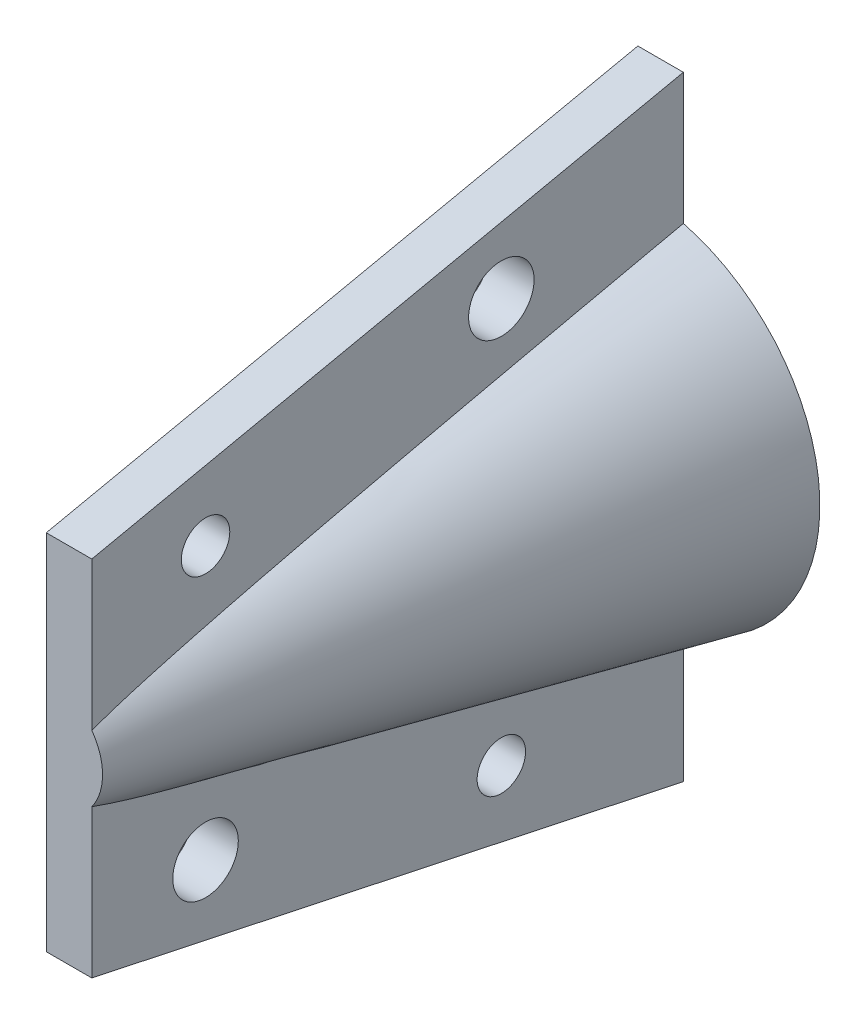
ISO-10303-21;
HEADER;
FILE_DESCRIPTION(('STEP AP214'),'2;1');
FILE_NAME('part.step','',(''),(''),'','','');
FILE_SCHEMA(('AUTOMOTIVE_DESIGN { 1 0 10303 214 1 1 1 1 }'));
ENDSEC;
DATA;
#1=APPLICATION_CONTEXT('core data for automotive mechanical design processes');
#2=APPLICATION_PROTOCOL_DEFINITION('international standard','automotive_design',2000,#1);
#3=PRODUCT_CONTEXT('',#1,'mechanical');
#4=PRODUCT('Part','Part','',(#3));
#5=PRODUCT_RELATED_PRODUCT_CATEGORY('part','',(#4));
#6=PRODUCT_DEFINITION_FORMATION('','',#4);
#7=PRODUCT_DEFINITION_CONTEXT('part definition',#1,'design');
#8=PRODUCT_DEFINITION('design','',#6,#7);
#9=PRODUCT_DEFINITION_SHAPE('','',#8);
#10=(LENGTH_UNIT() NAMED_UNIT(*) SI_UNIT(.MILLI.,.METRE.));
#11=(NAMED_UNIT(*) PLANE_ANGLE_UNIT() SI_UNIT($,.RADIAN.));
#12=(NAMED_UNIT(*) SI_UNIT($,.STERADIAN.) SOLID_ANGLE_UNIT());
#13=UNCERTAINTY_MEASURE_WITH_UNIT(LENGTH_MEASURE(1.E-05),#10,'distance_accuracy_value','');
#14=(GEOMETRIC_REPRESENTATION_CONTEXT(3) GLOBAL_UNCERTAINTY_ASSIGNED_CONTEXT((#13)) GLOBAL_UNIT_ASSIGNED_CONTEXT((#10,
#11,#12)) REPRESENTATION_CONTEXT('',''));
#15=CARTESIAN_POINT('',(0.,0.,0.));
#16=DIRECTION('',(0.,0.,1.));
#17=DIRECTION('',(1.,0.,0.));
#18=AXIS2_PLACEMENT_3D('',#15,#16,#17);
#19=CARTESIAN_POINT('',(0.,0.,0.));
#20=DIRECTION('',(0.,0.,1.));
#21=DIRECTION('',(1.,0.,0.));
#22=AXIS2_PLACEMENT_3D('',#19,#20,#21);
#23=PLANE('',#22);
#24=DIRECTION('',(1.,0.,0.));
#25=VECTOR('',#24,1.);
#26=CARTESIAN_POINT('',(-2.54000000000001,-17.145,0.));
#27=LINE('',#26,#25);
#28=CARTESIAN_POINT('',(0.,-17.145,0.));
#29=VERTEX_POINT('',#28);
#30=CARTESIAN_POINT('',(2.54000000000002,-17.145,0.));
#31=VERTEX_POINT('',#30);
#32=EDGE_CURVE('E188',#29,#31,#27,.T.);
#33=ORIENTED_EDGE('',*,*,#32,.F.);
#34=DIRECTION('',(0.,-1.,0.));
#35=VECTOR('',#34,1.);
#36=CARTESIAN_POINT('',(0.,-17.145,0.));
#37=LINE('',#36,#35);
#38=CARTESIAN_POINT('',(0.,-8.89,0.));
#39=VERTEX_POINT('',#38);
#40=EDGE_CURVE('E122',#39,#29,#37,.T.);
#41=ORIENTED_EDGE('',*,*,#40,.F.);
#42=CARTESIAN_POINT('',(0.,0.,0.));
#43=DIRECTION('',(0.,0.,1.));
#44=DIRECTION('',(1.,0.,0.));
#45=AXIS2_PLACEMENT_3D('',#42,#43,#44);
#46=CIRCLE('',#45,8.89);
#47=CARTESIAN_POINT('',(0.,8.89,0.));
#48=VERTEX_POINT('',#47);
#49=EDGE_CURVE('E121',#39,#48,#46,.T.);
#50=ORIENTED_EDGE('',*,*,#49,.T.);
#51=CARTESIAN_POINT('',(0.,17.145,0.));
#52=VERTEX_POINT('',#51);
#53=EDGE_CURVE('E104',#52,#48,#37,.T.);
#54=ORIENTED_EDGE('',*,*,#53,.F.);
#55=DIRECTION('',(-1.,0.,0.));
#56=VECTOR('',#55,1.);
#57=CARTESIAN_POINT('',(-2.53999999999999,17.145,0.));
#58=LINE('',#57,#56);
#59=CARTESIAN_POINT('',(2.54,17.145,0.));
#60=VERTEX_POINT('',#59);
#61=EDGE_CURVE('E118',#60,#52,#58,.T.);
#62=ORIENTED_EDGE('',*,*,#61,.F.);
#63=DIRECTION('',(0.,1.,0.));
#64=VECTOR('',#63,1.);
#65=CARTESIAN_POINT('',(2.54,17.145,0.));
#66=LINE('',#65,#64);
#67=CARTESIAN_POINT('',(2.54000000000001,9.83737769936683,0.));
#68=VERTEX_POINT('',#67);
#69=EDGE_CURVE('E127',#68,#60,#66,.T.);
#70=ORIENTED_EDGE('',*,*,#69,.F.);
#71=CARTESIAN_POINT('',(0.,0.,0.));
#72=DIRECTION('',(0.,0.,1.));
#73=DIRECTION('',(1.,0.,0.));
#74=AXIS2_PLACEMENT_3D('',#71,#72,#73);
#75=CIRCLE('',#74,10.16);
#76=CARTESIAN_POINT('',(2.54000000000002,-9.83737769936683,0.));
#77=VERTEX_POINT('',#76);
#78=EDGE_CURVE('E131',#77,#68,#75,.T.);
#79=ORIENTED_EDGE('',*,*,#78,.F.);
#80=DIRECTION('',(0.,1.,0.));
#81=VECTOR('',#80,1.);
#82=CARTESIAN_POINT('',(2.54000000000002,-9.83737769936683,0.));
#83=LINE('',#82,#81);
#84=EDGE_CURVE('E190',#31,#77,#83,.T.);
#85=ORIENTED_EDGE('',*,*,#84,.F.);
#86=EDGE_LOOP('',(#33,#41,#50,#54,#62,#70,#79,#85));
#87=FACE_BOUND('',#86,.T.);
#88=ADVANCED_FACE('F35',(#87),#23,.F.);
#89=CARTESIAN_POINT('',(-2.54000000000001,-17.145,0.));
#90=DIRECTION('',(0.,-0.978147600733806,0.207911690817759));
#91=DIRECTION('',(0.,-0.207911690817759,-0.978147600733806));
#92=AXIS2_PLACEMENT_3D('',#89,#90,#91);
#93=PLANE('',#92);
#94=DIRECTION('',(-1.,0.,0.));
#95=VECTOR('',#94,1.);
#96=CARTESIAN_POINT('',(-2.54000000000001,-10.1263823336559,33.02));
#97=LINE('',#96,#95);
#98=CARTESIAN_POINT('',(0.,-10.1263823336559,33.02));
#99=VERTEX_POINT('',#98);
#100=CARTESIAN_POINT('',(2.54000000000002,-10.1263823336559,33.02));
#101=VERTEX_POINT('',#100);
#102=EDGE_CURVE('E126',#99,#101,#97,.F.);
#103=ORIENTED_EDGE('',*,*,#102,.F.);
#104=DIRECTION('',(0.,0.207911690817759,0.978147600733806));
#105=VECTOR('',#104,1.);
#106=CARTESIAN_POINT('',(0.,-17.145,0.));
#107=LINE('',#106,#105);
#108=EDGE_CURVE('E110',#99,#29,#107,.F.);
#109=ORIENTED_EDGE('',*,*,#108,.T.);
#110=ORIENTED_EDGE('',*,*,#32,.T.);
#111=DIRECTION('',(0.,0.207911690817759,0.978147600733806));
#112=VECTOR('',#111,1.);
#113=CARTESIAN_POINT('',(2.54000000000002,-10.1138894519576,33.078774387392));
#114=LINE('',#113,#112);
#115=EDGE_CURVE('E11',#101,#31,#114,.F.);
#116=ORIENTED_EDGE('',*,*,#115,.F.);
#117=EDGE_LOOP('',(#103,#109,#110,#116));
#118=FACE_BOUND('',#117,.T.);
#119=ADVANCED_FACE('F154',(#118),#93,.T.);
#120=CARTESIAN_POINT('',(2.54000000000002,-9.83737769936683,33.02));
#121=DIRECTION('',(-1.,0.,0.));
#122=DIRECTION('',(0.,-1.,0.));
#123=AXIS2_PLACEMENT_3D('',#120,#121,#122);
#124=PLANE('',#123);
#125=CARTESIAN_POINT('',(2.54000000000002,-11.2859994979387,10.16));
#126=DIRECTION('',(-1.,0.,0.));
#127=DIRECTION('',(0.,-1.,0.));
#128=AXIS2_PLACEMENT_3D('',#125,#126,#127);
#129=CIRCLE('',#128,1.35254999999999);
#130=CARTESIAN_POINT('',(2.54000000000002,-12.6385494979387,10.16));
#131=VERTEX_POINT('',#130);
#132=EDGE_CURVE('E172',#131,#131,#129,.T.);
#133=ORIENTED_EDGE('',*,*,#132,.T.);
#134=EDGE_LOOP('',(#133));
#135=FACE_BOUND('',#134,.T.);
#136=CARTESIAN_POINT('',(2.54000000000002,-7.59012617854878,26.67));
#137=DIRECTION('',(-1.,0.,0.));
#138=DIRECTION('',(0.,-1.,0.));
#139=AXIS2_PLACEMENT_3D('',#136,#137,#138);
#140=CIRCLE('',#139,1.8288);
#141=CARTESIAN_POINT('',(2.54000000000002,-9.41892617854878,26.67));
#142=VERTEX_POINT('',#141);
#143=EDGE_CURVE('E169',#142,#142,#140,.T.);
#144=ORIENTED_EDGE('',*,*,#143,.T.);
#145=EDGE_LOOP('',(#144));
#146=FACE_BOUND('',#145,.T.);
#147=ORIENTED_EDGE('',*,*,#84,.T.);
#148=CARTESIAN_POINT('',(2.54000000000002,-9.83737769936683,0.));
#149=CARTESIAN_POINT('',(2.54000000000002,-9.68756772433314,0.682413990701998));
#150=CARTESIAN_POINT('',(2.54000000000002,-9.53755664341647,1.36478381665482));
#151=CARTESIAN_POINT('',(2.54000000000002,-9.23706393861361,2.72942018096307));
#152=CARTESIAN_POINT('',(2.54000000000002,-9.0865823145077,3.4116867192701));
#153=CARTESIAN_POINT('',(2.54000000000002,-8.63430453119013,5.45842028191158));
#154=CARTESIAN_POINT('',(2.54000000000002,-8.3317000930989,6.8227089423906));
#155=CARTESIAN_POINT('',(2.54000000000002,-7.72157487250142,9.55940087159057));
#156=CARTESIAN_POINT('',(2.54000000000002,-7.41403498609427,10.931799883625));
#157=CARTESIAN_POINT('',(2.54000000000002,-6.79469933495965,13.6755308297857));
#158=CARTESIAN_POINT('',(2.54000000000002,-6.48290389487147,15.0468628369664));
#159=CARTESIAN_POINT('',(2.54000000000002,-6.01823001727029,17.0682274434439));
#160=CARTESIAN_POINT('',(2.54000000000002,-5.8678882802859,17.7188429770867));
#161=CARTESIAN_POINT('',(2.54000000000002,-5.56533466250592,19.0196387689779));
#162=CARTESIAN_POINT('',(2.54000000000002,-5.41312278391347,19.6698190277382));
#163=CARTESIAN_POINT('',(2.54000000000002,-5.10627850511482,20.9697666746442));
#164=CARTESIAN_POINT('',(2.54000000000002,-4.9516455562409,21.6195339334352));
#165=CARTESIAN_POINT('',(2.54000000000002,-4.63925383578056,22.9183015412719));
#166=CARTESIAN_POINT('',(2.54000000000002,-4.4814951413943,23.56730190884));
#167=CARTESIAN_POINT('',(2.54000000000002,-4.1624688302227,24.8612601975363));
#168=CARTESIAN_POINT('',(2.54000000000002,-4.00122079931752,25.5062229393327));
#169=CARTESIAN_POINT('',(2.54000000000002,-3.67279458191474,26.7947146838397));
#170=CARTESIAN_POINT('',(2.54000000000002,-3.50561582594852,27.4382435425289));
#171=CARTESIAN_POINT('',(2.54000000000002,-3.24815581539548,28.4016676179463));
#172=CARTESIAN_POINT('',(2.54000000000002,-3.16123134505902,28.7224590095973));
#173=CARTESIAN_POINT('',(2.54000000000002,-2.98452465863213,29.363252329111));
#174=CARTESIAN_POINT('',(2.54000000000002,-2.89474247810544,29.6832542667451));
#175=CARTESIAN_POINT('',(2.54000000000002,-2.71148241730856,30.3221471797272));
#176=CARTESIAN_POINT('',(2.54000000000002,-2.61800511162621,30.6410383194771));
#177=CARTESIAN_POINT('',(2.54000000000002,-2.42607102736818,31.2773138481783));
#178=CARTESIAN_POINT('',(2.54000000000002,-2.3276145293265,31.5946983209176));
#179=CARTESIAN_POINT('',(2.54000000000002,-2.18662033533218,32.0318202024427));
#180=CARTESIAN_POINT('',(2.54000000000002,-2.14711168360863,32.1525342013287));
#181=CARTESIAN_POINT('',(2.54000000000002,-2.06686963714619,32.3935515426582));
#182=CARTESIAN_POINT('',(2.54000000000002,-2.02613625603091,32.5138548896531));
#183=CARTESIAN_POINT('',(2.54000000000002,-1.90184786529841,32.8739279679377));
#184=CARTESIAN_POINT('',(2.54000000000002,-1.81616695709921,33.1129787681758));
#185=CARTESIAN_POINT('',(2.54000000000002,-1.68135865303506,33.4694450811361));
#186=CARTESIAN_POINT('',(2.54000000000002,-1.6353266004435,33.5880305305546));
#187=CARTESIAN_POINT('',(2.54000000000002,-1.54065974872791,33.8241398865244));
#188=CARTESIAN_POINT('',(2.54000000000002,-1.4920253822858,33.9416639657732));
#189=CARTESIAN_POINT('',(2.54000000000002,-1.39135416542274,34.1754686135184));
#190=CARTESIAN_POINT('',(2.54000000000002,-1.33931235263483,34.2917470679559));
#191=CARTESIAN_POINT('',(2.54000000000002,-1.25790811791961,34.4646326770273));
#192=CARTESIAN_POINT('',(2.54000000000002,-1.23020822705165,34.522021726785));
#193=CARTESIAN_POINT('',(2.54000000000002,-1.17348385569872,34.6361515415849));
#194=CARTESIAN_POINT('',(2.54000000000002,-1.14445916874566,34.6928922038419));
#195=CARTESIAN_POINT('',(2.54000000000002,-1.11466907754045,34.7492365451219));
#196=B_SPLINE_CURVE_WITH_KNOTS('',3,(#148,#149,#150,#151,#152,#153,#154,#155,#156,#157,#158,
#159,#160,#161,#162,#163,#164,#165,#166,#167,#168,#169,#170,#171,#172,#173,#174,#175,#176,#177,
#178,#179,#180,#181,#182,#183,#184,#185,#186,#187,#188,#189,#190,#191,#192,#193,#194,#195),
.UNSPECIFIED.,.F.,.F.,(4,2,2,2,2,2,2,2,2,2,2,2,2,2,2,2,2,2,2,2,2,2,2,4),(0.,2.09599298225496,
4.19198694341505,8.3843198084463,12.6036214784442,16.8226030540303,18.8258805496714,
20.8291556855578,22.8328915745232,24.8365780364376,26.8310044840718,28.8256229577834,
29.8226926242112,30.8197498871136,31.8166527139548,32.8134994364646,33.1945380056024,
33.5755723377205,34.3372693856696,34.7188653847714,35.100398132582,35.4824994390271,
35.6736572018797,35.8648448588759),.UNSPECIFIED.);
#197=CARTESIAN_POINT('',(2.54000000000002,-1.84842716010257,33.02));
#198=VERTEX_POINT('',#197);
#199=EDGE_CURVE('E44',#198,#77,#196,.F.);
#200=ORIENTED_EDGE('',*,*,#199,.F.);
#201=DIRECTION('',(0.,1.,0.));
#202=VECTOR('',#201,1.);
#203=CARTESIAN_POINT('',(2.54000000000002,-9.83737769936683,33.02));
#204=LINE('',#203,#202);
#205=EDGE_CURVE('E129',#101,#198,#204,.T.);
#206=ORIENTED_EDGE('',*,*,#205,.F.);
#207=ORIENTED_EDGE('',*,*,#115,.T.);
#208=EDGE_LOOP('',(#147,#200,#206,#207));
#209=FACE_BOUND('',#208,.T.);
#210=ADVANCED_FACE('F150',(#135,#146,#209),#124,.F.);
#211=CARTESIAN_POINT('',(0.,0.,0.));
#212=DIRECTION('',(0.,0.,-1.));
#213=DIRECTION('',(1.,0.,0.));
#214=AXIS2_PLACEMENT_3D('',#211,#212,#213);
#215=CONICAL_SURFACE('',#214,10.16,0.20943951023932);
#216=ORIENTED_EDGE('',*,*,#78,.T.);
#217=CARTESIAN_POINT('',(2.54000000000002,1.84842716010258,33.02));
#218=CARTESIAN_POINT('',(2.54000000000002,1.88532649026919,32.9178343025848));
#219=CARTESIAN_POINT('',(2.54000000000002,1.92159846079302,32.8154445786237));
#220=CARTESIAN_POINT('',(2.54000000000002,1.9930437538059,32.6102857652073));
#221=CARTESIAN_POINT('',(2.54000000000002,2.02821711019649,32.507516687568));
#222=CARTESIAN_POINT('',(2.54000000000002,2.13231820827504,32.1987591572988));
#223=CARTESIAN_POINT('',(2.54000000000002,2.19983593540039,31.9922953634997));
#224=CARTESIAN_POINT('',(2.54000000000002,2.33195163464846,31.5785206024548));
#225=CARTESIAN_POINT('',(2.54000000000002,2.39655061821071,31.371209956251));
#226=CARTESIAN_POINT('',(2.54000000000002,2.52344313226656,30.9558779252721));
#227=CARTESIAN_POINT('',(2.54000000000002,2.58573657972657,30.747856515193));
#228=CARTESIAN_POINT('',(2.54000000000002,2.76975780744669,30.1232126676885));
#229=CARTESIAN_POINT('',(2.54000000000002,2.88870177856666,29.7057708577681));
#230=CARTESIAN_POINT('',(2.54000000000002,3.121455027043,28.8694192444513));
#231=CARTESIAN_POINT('',(2.54000000000002,3.23526372060184,28.4505092799543));
#232=CARTESIAN_POINT('',(2.54000000000002,3.45892821428563,27.612273252775));
#233=CARTESIAN_POINT('',(2.54000000000002,3.56878938525734,27.1929486199949));
#234=CARTESIAN_POINT('',(2.54000000000002,3.78563191227972,26.353554169401));
#235=CARTESIAN_POINT('',(2.54000000000001,3.89261324655157,25.9334843459774));
#236=CARTESIAN_POINT('',(2.54000000000001,4.10432066604424,25.0927659759743));
#237=CARTESIAN_POINT('',(2.54000000000001,4.20904669221686,24.6721174145485));
#238=CARTESIAN_POINT('',(2.54000000000001,4.41668569774778,23.8303726743704));
#239=CARTESIAN_POINT('',(2.54000000000001,4.51959867278519,23.4092764945537));
#240=CARTESIAN_POINT('',(2.54000000000001,4.82614308903227,22.1454267084387));
#241=CARTESIAN_POINT('',(2.54000000000001,5.02757315653803,21.3021393217278));
#242=CARTESIAN_POINT('',(2.54000000000001,5.42636416038714,19.6146204307214));
#243=CARTESIAN_POINT('',(2.54000000000001,5.62372515969055,18.7703889412473));
#244=CARTESIAN_POINT('',(2.54000000000001,6.01562534340995,17.0805817149503));
#245=CARTESIAN_POINT('',(2.54000000000001,6.21016221980736,16.2350054433735));
#246=CARTESIAN_POINT('',(2.54000000000001,6.59698692638984,14.5433360273084));
#247=CARTESIAN_POINT('',(2.54000000000001,6.78927474815966,13.6972428808985));
#248=CARTESIAN_POINT('',(2.54000000000001,7.36354195087345,11.158441241484));
#249=CARTESIAN_POINT('',(2.54000000000001,7.74293930519382,9.46514878074614));
#250=CARTESIAN_POINT('',(2.54000000000001,8.26436886126616,7.12381998866297));
#251=CARTESIAN_POINT('',(2.54000000000001,8.40826417541228,6.47619683489967));
#252=CARTESIAN_POINT('',(2.54000000000001,8.69549462246491,5.1808217177119));
#253=CARTESIAN_POINT('',(2.54000000000001,8.83882975168182,4.53306975346845));
#254=CARTESIAN_POINT('',(2.54000000000001,9.12494099369508,3.23781546339532));
#255=CARTESIAN_POINT('',(2.54000000000001,9.267717370226,2.5903131957885));
#256=CARTESIAN_POINT('',(2.54000000000001,9.55284859361736,1.29522049260085));
#257=CARTESIAN_POINT('',(2.54000000000001,9.69520344335438,0.647630057653384));
#258=CARTESIAN_POINT('',(2.54000000000001,9.83737769936684,0.));
#259=B_SPLINE_CURVE_WITH_KNOTS('',3,(#217,#218,#219,#220,#221,#222,#223,#224,#225,#226,#227,
#228,#229,#230,#231,#232,#233,#234,#235,#236,#237,#238,#239,#240,#241,#242,#243,#244,#245,#246,
#247,#248,#249,#250,#251,#252,#253,#254,#255,#256,#257,#258),.UNSPECIFIED.,.F.,.F.,(4,2,2,2,2,2,
2,2,2,2,2,2,2,2,2,2,2,2,2,2,4),(0.,0.325869280104377,0.651728494432599,1.30336714529924,
1.95477822257267,2.60621273755009,3.90832798367286,5.21059088807494,6.51100916318767,
7.811437269972,9.11189938310872,10.4123645950969,13.0133799503532,15.6143550302497,
18.2173480046348,20.8203507154894,26.026165978288,28.0164159067599,30.0066789218138,
31.995849104548,33.9850056813769),.UNSPECIFIED.);
#260=CARTESIAN_POINT('',(2.54000000000002,1.84842716010258,33.02));
#261=VERTEX_POINT('',#260);
#262=EDGE_CURVE('E146',#261,#68,#259,.T.);
#263=ORIENTED_EDGE('',*,*,#262,.F.);
#264=CARTESIAN_POINT('',(0.,0.,33.02));
#265=DIRECTION('',(0.,0.,1.));
#266=DIRECTION('',(1.,0.,0.));
#267=AXIS2_PLACEMENT_3D('',#264,#265,#266);
#268=CIRCLE('',#267,3.14138233365587);
#269=EDGE_CURVE('E136',#198,#261,#268,.T.);
#270=ORIENTED_EDGE('',*,*,#269,.F.);
#271=ORIENTED_EDGE('',*,*,#199,.T.);
#272=EDGE_LOOP('',(#216,#263,#270,#271));
#273=FACE_BOUND('',#272,.T.);
#274=ADVANCED_FACE('F148',(#273),#215,.T.);
#275=CARTESIAN_POINT('',(2.54,17.145,33.02));
#276=DIRECTION('',(-1.,0.,0.));
#277=DIRECTION('',(0.,-1.,0.));
#278=AXIS2_PLACEMENT_3D('',#275,#276,#277);
#279=PLANE('',#278);
#280=CARTESIAN_POINT('',(2.54000000000001,7.59012617854878,26.67));
#281=DIRECTION('',(-1.,0.,0.));
#282=DIRECTION('',(0.,-1.,0.));
#283=AXIS2_PLACEMENT_3D('',#280,#281,#282);
#284=CIRCLE('',#283,1.35254999999999);
#285=CARTESIAN_POINT('',(2.54000000000001,6.23757617854879,26.67));
#286=VERTEX_POINT('',#285);
#287=EDGE_CURVE('E174',#286,#286,#284,.T.);
#288=ORIENTED_EDGE('',*,*,#287,.T.);
#289=EDGE_LOOP('',(#288));
#290=FACE_BOUND('',#289,.T.);
#291=CARTESIAN_POINT('',(2.54000000000001,11.2859994979387,10.16));
#292=DIRECTION('',(-1.,0.,0.));
#293=DIRECTION('',(0.,-1.,0.));
#294=AXIS2_PLACEMENT_3D('',#291,#292,#293);
#295=CIRCLE('',#294,1.8288);
#296=CARTESIAN_POINT('',(2.54000000000001,9.45719949793872,10.16));
#297=VERTEX_POINT('',#296);
#298=EDGE_CURVE('E171',#297,#297,#295,.T.);
#299=ORIENTED_EDGE('',*,*,#298,.T.);
#300=EDGE_LOOP('',(#299));
#301=FACE_BOUND('',#300,.T.);
#302=ORIENTED_EDGE('',*,*,#69,.T.);
#303=DIRECTION('',(0.,-0.207911690817759,0.978147600733806));
#304=VECTOR('',#303,1.);
#305=CARTESIAN_POINT('',(2.54,17.145,0.));
#306=LINE('',#305,#304);
#307=CARTESIAN_POINT('',(2.54000000000001,10.1263823336558,33.02));
#308=VERTEX_POINT('',#307);
#309=EDGE_CURVE('E125',#308,#60,#306,.F.);
#310=ORIENTED_EDGE('',*,*,#309,.F.);
#311=DIRECTION('',(0.,1.,0.));
#312=VECTOR('',#311,1.);
#313=CARTESIAN_POINT('',(2.54,17.145,33.02));
#314=LINE('',#313,#312);
#315=EDGE_CURVE('E60',#261,#308,#314,.T.);
#316=ORIENTED_EDGE('',*,*,#315,.F.);
#317=ORIENTED_EDGE('',*,*,#262,.T.);
#318=EDGE_LOOP('',(#302,#310,#316,#317));
#319=FACE_BOUND('',#318,.T.);
#320=ADVANCED_FACE('F156',(#290,#301,#319),#279,.F.);
#321=CARTESIAN_POINT('',(-2.53999999999999,17.145,0.));
#322=DIRECTION('',(0.,0.978147600733806,0.207911690817759));
#323=DIRECTION('',(0.,-0.207911690817759,0.978147600733806));
#324=AXIS2_PLACEMENT_3D('',#321,#322,#323);
#325=PLANE('',#324);
#326=ORIENTED_EDGE('',*,*,#61,.T.);
#327=DIRECTION('',(0.,0.207911690817759,-0.978147600733806));
#328=VECTOR('',#327,1.);
#329=CARTESIAN_POINT('',(0.,17.145,0.));
#330=LINE('',#329,#328);
#331=CARTESIAN_POINT('',(0.,10.1263823336558,33.02));
#332=VERTEX_POINT('',#331);
#333=EDGE_CURVE('E101',#52,#332,#330,.F.);
#334=ORIENTED_EDGE('',*,*,#333,.T.);
#335=DIRECTION('',(1.,0.,0.));
#336=VECTOR('',#335,1.);
#337=CARTESIAN_POINT('',(-2.53999999999999,10.1263823336558,33.02));
#338=LINE('',#337,#336);
#339=EDGE_CURVE('E137',#308,#332,#338,.F.);
#340=ORIENTED_EDGE('',*,*,#339,.F.);
#341=ORIENTED_EDGE('',*,*,#309,.T.);
#342=EDGE_LOOP('',(#326,#334,#340,#341));
#343=FACE_BOUND('',#342,.T.);
#344=ADVANCED_FACE('F37',(#343),#325,.T.);
#345=CARTESIAN_POINT('',(0.,0.,33.02));
#346=DIRECTION('',(0.,0.,1.));
#347=DIRECTION('',(1.,0.,0.));
#348=AXIS2_PLACEMENT_3D('',#345,#346,#347);
#349=PLANE('',#348);
#350=DIRECTION('',(0.,-1.,0.));
#351=VECTOR('',#350,1.);
#352=CARTESIAN_POINT('',(0.,-17.145,33.02));
#353=LINE('',#352,#351);
#354=EDGE_CURVE('E106',#332,#99,#353,.T.);
#355=ORIENTED_EDGE('',*,*,#354,.T.);
#356=ORIENTED_EDGE('',*,*,#102,.T.);
#357=ORIENTED_EDGE('',*,*,#205,.T.);
#358=ORIENTED_EDGE('',*,*,#269,.T.);
#359=ORIENTED_EDGE('',*,*,#315,.T.);
#360=ORIENTED_EDGE('',*,*,#339,.T.);
#361=EDGE_LOOP('',(#355,#356,#357,#358,#359,#360));
#362=FACE_BOUND('',#361,.T.);
#363=ADVANCED_FACE('F198',(#362),#349,.T.);
#364=CARTESIAN_POINT('',(0.,0.,0.));
#365=DIRECTION('',(0.,0.,-1.));
#366=DIRECTION('',(1.,0.,0.));
#367=AXIS2_PLACEMENT_3D('',#364,#365,#366);
#368=CONICAL_SURFACE('',#367,8.89,0.244346095279206);
#369=DIRECTION('',(0.,-0.241921895599668,-0.970295726275996));
#370=VECTOR('',#369,1.);
#371=CARTESIAN_POINT('',(0.,0.,35.6558424991336));
#372=LINE('',#371,#370);
#373=CARTESIAN_POINT('',(0.,-1.29048247333985,30.48));
#374=VERTEX_POINT('',#373);
#375=EDGE_CURVE('E111',#374,#39,#372,.T.);
#376=ORIENTED_EDGE('',*,*,#375,.F.);
#377=CARTESIAN_POINT('',(0.,0.,30.48));
#378=DIRECTION('',(0.,0.,1.));
#379=DIRECTION('',(1.,0.,0.));
#380=AXIS2_PLACEMENT_3D('',#377,#378,#379);
#381=CIRCLE('',#380,1.29048247333985);
#382=CARTESIAN_POINT('',(0.,1.29048247333985,30.48));
#383=VERTEX_POINT('',#382);
#384=EDGE_CURVE('E185',#374,#383,#381,.T.);
#385=ORIENTED_EDGE('',*,*,#384,.T.);
#386=DIRECTION('',(0.,-0.241921895599668,0.970295726275996));
#387=VECTOR('',#386,1.);
#388=CARTESIAN_POINT('',(0.,0.,35.6558424991336));
#389=LINE('',#388,#387);
#390=EDGE_CURVE('E52',#48,#383,#389,.T.);
#391=ORIENTED_EDGE('',*,*,#390,.F.);
#392=ORIENTED_EDGE('',*,*,#49,.F.);
#393=EDGE_LOOP('',(#376,#385,#391,#392));
#394=FACE_BOUND('',#393,.T.);
#395=ADVANCED_FACE('F207',(#394),#368,.F.);
#396=CARTESIAN_POINT('',(0.,0.,29.4862047133879));
#397=DIRECTION('',(0.,0.,1.));
#398=DIRECTION('',(1.,0.,0.));
#399=AXIS2_PLACEMENT_3D('',#396,#397,#398);
#400=SPHERICAL_SURFACE('',#399,1.62879528661208);
#401=ORIENTED_EDGE('',*,*,#384,.F.);
#402=CARTESIAN_POINT('',(0.,0.,29.4862047133879));
#403=DIRECTION('',(1.,0.,0.));
#404=DIRECTION('',(0.,1.,0.));
#405=AXIS2_PLACEMENT_3D('',#402,#403,#404);
#406=CIRCLE('',#405,1.62879528661208);
#407=EDGE_CURVE('E209',#374,#383,#406,.F.);
#408=ORIENTED_EDGE('',*,*,#407,.T.);
#409=EDGE_LOOP('',(#401,#408));
#410=FACE_BOUND('',#409,.T.);
#411=ADVANCED_FACE('F241',(#410),#400,.F.);
#412=CARTESIAN_POINT('',(-2.54000000000001,-7.59012617854878,26.67));
#413=DIRECTION('',(-1.,0.,0.));
#414=DIRECTION('',(0.,0.,1.));
#415=AXIS2_PLACEMENT_3D('',#412,#413,#414);
#416=CYLINDRICAL_SURFACE('',#415,1.8288);
#417=CARTESIAN_POINT('',(0.,-7.59012617854878,26.67));
#418=DIRECTION('',(1.,0.,0.));
#419=DIRECTION('',(0.,1.,0.));
#420=AXIS2_PLACEMENT_3D('',#417,#418,#419);
#421=CIRCLE('',#420,1.8288);
#422=CARTESIAN_POINT('',(0.,-5.76132617854878,26.67));
#423=VERTEX_POINT('',#422);
#424=EDGE_CURVE('E212',#423,#423,#421,.F.);
#425=ORIENTED_EDGE('',*,*,#424,.T.);
#426=EDGE_LOOP('',(#425));
#427=FACE_BOUND('',#426,.T.);
#428=ORIENTED_EDGE('',*,*,#143,.F.);
#429=EDGE_LOOP('',(#428));
#430=FACE_BOUND('',#429,.T.);
#431=ADVANCED_FACE('F237',(#427,#430),#416,.F.);
#432=CARTESIAN_POINT('',(-2.54,11.2859994979387,10.16));
#433=DIRECTION('',(-1.,0.,0.));
#434=DIRECTION('',(0.,0.,1.));
#435=AXIS2_PLACEMENT_3D('',#432,#433,#434);
#436=CYLINDRICAL_SURFACE('',#435,1.8288);
#437=CARTESIAN_POINT('',(0.,11.2859994979387,10.16));
#438=DIRECTION('',(1.,0.,0.));
#439=DIRECTION('',(0.,1.,0.));
#440=AXIS2_PLACEMENT_3D('',#437,#438,#439);
#441=CIRCLE('',#440,1.8288);
#442=CARTESIAN_POINT('',(0.,13.1147994979387,10.16));
#443=VERTEX_POINT('',#442);
#444=EDGE_CURVE('E217',#443,#443,#441,.F.);
#445=ORIENTED_EDGE('',*,*,#444,.T.);
#446=EDGE_LOOP('',(#445));
#447=FACE_BOUND('',#446,.T.);
#448=ORIENTED_EDGE('',*,*,#298,.F.);
#449=EDGE_LOOP('',(#448));
#450=FACE_BOUND('',#449,.T.);
#451=ADVANCED_FACE('F240',(#447,#450),#436,.F.);
#452=CARTESIAN_POINT('',(-2.54000000000001,-11.2859994979387,10.16));
#453=DIRECTION('',(-1.,0.,0.));
#454=DIRECTION('',(0.,0.,1.));
#455=AXIS2_PLACEMENT_3D('',#452,#453,#454);
#456=CYLINDRICAL_SURFACE('',#455,1.35254999999999);
#457=CARTESIAN_POINT('',(0.,-11.2859994979387,10.16));
#458=DIRECTION('',(1.,0.,0.));
#459=DIRECTION('',(0.,1.,0.));
#460=AXIS2_PLACEMENT_3D('',#457,#458,#459);
#461=CIRCLE('',#460,1.35254999999999);
#462=CARTESIAN_POINT('',(0.,-9.93344949793873,10.16));
#463=VERTEX_POINT('',#462);
#464=EDGE_CURVE('E220',#463,#463,#461,.F.);
#465=ORIENTED_EDGE('',*,*,#464,.T.);
#466=EDGE_LOOP('',(#465));
#467=FACE_BOUND('',#466,.T.);
#468=ORIENTED_EDGE('',*,*,#132,.F.);
#469=EDGE_LOOP('',(#468));
#470=FACE_BOUND('',#469,.T.);
#471=ADVANCED_FACE('F249',(#467,#470),#456,.F.);
#472=CARTESIAN_POINT('',(-2.54,7.59012617854878,26.67));
#473=DIRECTION('',(-1.,0.,0.));
#474=DIRECTION('',(0.,0.,1.));
#475=AXIS2_PLACEMENT_3D('',#472,#473,#474);
#476=CYLINDRICAL_SURFACE('',#475,1.35254999999999);
#477=CARTESIAN_POINT('',(0.,7.59012617854878,26.67));
#478=DIRECTION('',(1.,0.,0.));
#479=DIRECTION('',(0.,1.,0.));
#480=AXIS2_PLACEMENT_3D('',#477,#478,#479);
#481=CIRCLE('',#480,1.35254999999999);
#482=CARTESIAN_POINT('',(0.,8.94267617854877,26.67));
#483=VERTEX_POINT('',#482);
#484=EDGE_CURVE('E39',#483,#483,#481,.F.);
#485=ORIENTED_EDGE('',*,*,#484,.T.);
#486=EDGE_LOOP('',(#485));
#487=FACE_BOUND('',#486,.T.);
#488=ORIENTED_EDGE('',*,*,#287,.F.);
#489=EDGE_LOOP('',(#488));
#490=FACE_BOUND('',#489,.T.);
#491=ADVANCED_FACE('F227',(#487,#490),#476,.F.);
#492=CARTESIAN_POINT('',(0.,-17.145,33.02));
#493=DIRECTION('',(1.,0.,0.));
#494=DIRECTION('',(0.,1.,0.));
#495=AXIS2_PLACEMENT_3D('',#492,#493,#494);
#496=PLANE('',#495);
#497=ORIENTED_EDGE('',*,*,#444,.F.);
#498=EDGE_LOOP('',(#497));
#499=FACE_BOUND('',#498,.T.);
#500=ORIENTED_EDGE('',*,*,#484,.F.);
#501=EDGE_LOOP('',(#500));
#502=FACE_BOUND('',#501,.T.);
#503=ORIENTED_EDGE('',*,*,#464,.F.);
#504=EDGE_LOOP('',(#503));
#505=FACE_BOUND('',#504,.T.);
#506=ORIENTED_EDGE('',*,*,#424,.F.);
#507=EDGE_LOOP('',(#506));
#508=FACE_BOUND('',#507,.T.);
#509=ORIENTED_EDGE('',*,*,#354,.F.);
#510=ORIENTED_EDGE('',*,*,#333,.F.);
#511=ORIENTED_EDGE('',*,*,#53,.T.);
#512=ORIENTED_EDGE('',*,*,#390,.T.);
#513=ORIENTED_EDGE('',*,*,#407,.F.);
#514=ORIENTED_EDGE('',*,*,#375,.T.);
#515=ORIENTED_EDGE('',*,*,#40,.T.);
#516=ORIENTED_EDGE('',*,*,#108,.F.);
#517=EDGE_LOOP('',(#509,#510,#511,#512,#513,#514,#515,#516));
#518=FACE_BOUND('',#517,.T.);
#519=ADVANCED_FACE('F103',(#499,#502,#505,#508,#518),#496,.F.);
#520=CLOSED_SHELL('',(#88,#119,#210,#274,#320,#344,#363,#395,#411,#431,#451,#471,#491,#519));
#521=MANIFOLD_SOLID_BREP('B2',#520);
#522=ADVANCED_BREP_SHAPE_REPRESENTATION('',(#18,#521),#14);
#523=SHAPE_DEFINITION_REPRESENTATION(#9,#522);
ENDSEC;
END-ISO-10303-21;
